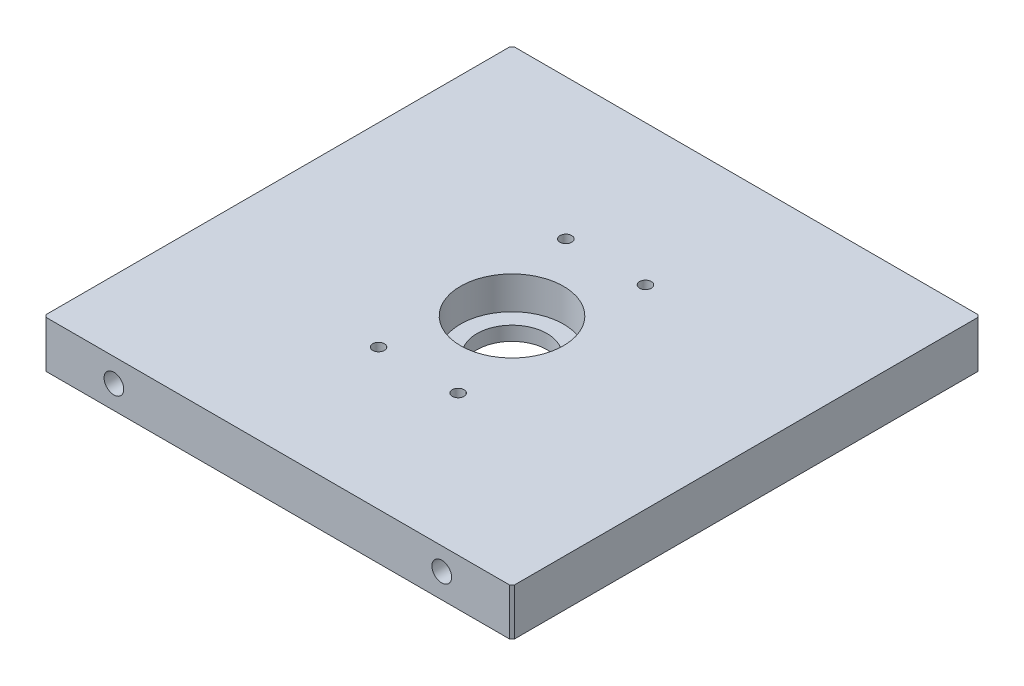
ISO-10303-21;
HEADER;
FILE_DESCRIPTION(('STEP AP214'),'2;1');
FILE_NAME('part.step','',(''),(''),'','','');
FILE_SCHEMA(('AUTOMOTIVE_DESIGN { 1 0 10303 214 1 1 1 1 }'));
ENDSEC;
DATA;
#1=APPLICATION_CONTEXT('core data for automotive mechanical design processes');
#2=APPLICATION_PROTOCOL_DEFINITION('international standard','automotive_design',2000,#1);
#3=PRODUCT_CONTEXT('',#1,'mechanical');
#4=PRODUCT('Part','Part','',(#3));
#5=PRODUCT_RELATED_PRODUCT_CATEGORY('part','',(#4));
#6=PRODUCT_DEFINITION_FORMATION('','',#4);
#7=PRODUCT_DEFINITION_CONTEXT('part definition',#1,'design');
#8=PRODUCT_DEFINITION('design','',#6,#7);
#9=PRODUCT_DEFINITION_SHAPE('','',#8);
#10=(LENGTH_UNIT() NAMED_UNIT(*) SI_UNIT(.MILLI.,.METRE.));
#11=(NAMED_UNIT(*) PLANE_ANGLE_UNIT() SI_UNIT($,.RADIAN.));
#12=(NAMED_UNIT(*) SI_UNIT($,.STERADIAN.) SOLID_ANGLE_UNIT());
#13=UNCERTAINTY_MEASURE_WITH_UNIT(LENGTH_MEASURE(1.E-05),#10,'distance_accuracy_value','');
#14=(GEOMETRIC_REPRESENTATION_CONTEXT(3) GLOBAL_UNCERTAINTY_ASSIGNED_CONTEXT((#13)) GLOBAL_UNIT_ASSIGNED_CONTEXT((#10,
#11,#12)) REPRESENTATION_CONTEXT('',''));
#15=CARTESIAN_POINT('',(0.,0.,0.));
#16=DIRECTION('',(0.,0.,1.));
#17=DIRECTION('',(1.,0.,0.));
#18=AXIS2_PLACEMENT_3D('',#15,#16,#17);
#19=CARTESIAN_POINT('',(0.,-5.,0.));
#20=DIRECTION('',(0.,1.,0.));
#21=DIRECTION('',(0.,0.,1.));
#22=AXIS2_PLACEMENT_3D('',#19,#20,#21);
#23=CYLINDRICAL_SURFACE('',#22,7.5);
#24=CARTESIAN_POINT('',(0.,-5.,0.));
#25=DIRECTION('',(0.,1.,0.));
#26=DIRECTION('',(0.,0.,1.));
#27=AXIS2_PLACEMENT_3D('',#24,#25,#26);
#28=CIRCLE('',#27,7.5);
#29=CARTESIAN_POINT('',(0.,-5.,7.5));
#30=VERTEX_POINT('',#29);
#31=EDGE_CURVE('E196',#30,#30,#28,.T.);
#32=ORIENTED_EDGE('',*,*,#31,.F.);
#33=EDGE_LOOP('',(#32));
#34=FACE_BOUND('',#33,.T.);
#35=CARTESIAN_POINT('',(0.,-2.,0.));
#36=DIRECTION('',(0.,1.,0.));
#37=DIRECTION('',(0.,0.,1.));
#38=AXIS2_PLACEMENT_3D('',#35,#36,#37);
#39=CIRCLE('',#38,7.5);
#40=CARTESIAN_POINT('',(0.,-2.,7.5));
#41=VERTEX_POINT('',#40);
#42=EDGE_CURVE('E181',#41,#41,#39,.F.);
#43=ORIENTED_EDGE('',*,*,#42,.F.);
#44=EDGE_LOOP('',(#43));
#45=FACE_BOUND('',#44,.T.);
#46=ADVANCED_FACE('F33',(#34,#45),#23,.F.);
#47=CARTESIAN_POINT('',(-50.,-5.,-50.));
#48=DIRECTION('',(-1.,0.,0.));
#49=DIRECTION('',(0.,0.,1.));
#50=AXIS2_PLACEMENT_3D('',#47,#48,#49);
#51=PLANE('',#50);
#52=DIRECTION('',(0.,0.,1.));
#53=VECTOR('',#52,1.);
#54=CARTESIAN_POINT('',(-50.,5.,-50.));
#55=LINE('',#54,#53);
#56=CARTESIAN_POINT('',(-50.,5.,-49.5));
#57=VERTEX_POINT('',#56);
#58=CARTESIAN_POINT('',(-50.,5.,49.5));
#59=VERTEX_POINT('',#58);
#60=EDGE_CURVE('E184',#57,#59,#55,.T.);
#61=ORIENTED_EDGE('',*,*,#60,.F.);
#62=DIRECTION('',(0.,-1.,0.));
#63=VECTOR('',#62,1.);
#64=CARTESIAN_POINT('',(-50.,-5.,-49.5));
#65=LINE('',#64,#63);
#66=CARTESIAN_POINT('',(-50.,-5.,-49.5));
#67=VERTEX_POINT('',#66);
#68=EDGE_CURVE('E240',#57,#67,#65,.T.);
#69=ORIENTED_EDGE('',*,*,#68,.T.);
#70=DIRECTION('',(0.,0.,1.));
#71=VECTOR('',#70,1.);
#72=CARTESIAN_POINT('',(-50.,-5.,-50.));
#73=LINE('',#72,#71);
#74=CARTESIAN_POINT('',(-50.,-5.,49.5));
#75=VERTEX_POINT('',#74);
#76=EDGE_CURVE('E199',#67,#75,#73,.T.);
#77=ORIENTED_EDGE('',*,*,#76,.T.);
#78=DIRECTION('',(0.,1.,0.));
#79=VECTOR('',#78,1.);
#80=CARTESIAN_POINT('',(-50.,-5.,49.5));
#81=LINE('',#80,#79);
#82=EDGE_CURVE('E237',#75,#59,#81,.T.);
#83=ORIENTED_EDGE('',*,*,#82,.T.);
#84=EDGE_LOOP('',(#61,#69,#77,#83));
#85=FACE_BOUND('',#84,.T.);
#86=ADVANCED_FACE('F254',(#85),#51,.T.);
#87=CARTESIAN_POINT('',(-50.,-5.,-50.));
#88=DIRECTION('',(0.,0.,-1.));
#89=DIRECTION('',(-1.,0.,0.));
#90=AXIS2_PLACEMENT_3D('',#87,#88,#89);
#91=PLANE('',#90);
#92=CARTESIAN_POINT('',(-35.,0.,-50.));
#93=DIRECTION('',(0.,0.,-1.));
#94=DIRECTION('',(-1.,0.,0.));
#95=AXIS2_PLACEMENT_3D('',#92,#93,#94);
#96=CIRCLE('',#95,2.1);
#97=CARTESIAN_POINT('',(-37.1,0.,-50.));
#98=VERTEX_POINT('',#97);
#99=EDGE_CURVE('E153',#98,#98,#96,.T.);
#100=ORIENTED_EDGE('',*,*,#99,.F.);
#101=EDGE_LOOP('',(#100));
#102=FACE_BOUND('',#101,.T.);
#103=CARTESIAN_POINT('',(35.,0.2375,-50.));
#104=DIRECTION('',(0.,0.,-1.));
#105=DIRECTION('',(-1.,0.,0.));
#106=AXIS2_PLACEMENT_3D('',#103,#104,#105);
#107=CIRCLE('',#106,2.1);
#108=CARTESIAN_POINT('',(32.9,0.2375,-50.));
#109=VERTEX_POINT('',#108);
#110=EDGE_CURVE('E159',#109,#109,#107,.T.);
#111=ORIENTED_EDGE('',*,*,#110,.F.);
#112=EDGE_LOOP('',(#111));
#113=FACE_BOUND('',#112,.T.);
#114=DIRECTION('',(-1.,0.,0.));
#115=VECTOR('',#114,1.);
#116=CARTESIAN_POINT('',(-50.,5.,-50.));
#117=LINE('',#116,#115);
#118=CARTESIAN_POINT('',(49.5,5.,-50.));
#119=VERTEX_POINT('',#118);
#120=CARTESIAN_POINT('',(-49.5,5.,-50.));
#121=VERTEX_POINT('',#120);
#122=EDGE_CURVE('E193',#119,#121,#117,.T.);
#123=ORIENTED_EDGE('',*,*,#122,.F.);
#124=DIRECTION('',(0.,-1.,0.));
#125=VECTOR('',#124,1.);
#126=CARTESIAN_POINT('',(49.5,-5.,-50.));
#127=LINE('',#126,#125);
#128=CARTESIAN_POINT('',(49.5,-5.,-50.));
#129=VERTEX_POINT('',#128);
#130=EDGE_CURVE('E228',#119,#129,#127,.T.);
#131=ORIENTED_EDGE('',*,*,#130,.T.);
#132=DIRECTION('',(-1.,0.,0.));
#133=VECTOR('',#132,1.);
#134=CARTESIAN_POINT('',(-50.,-5.,-50.));
#135=LINE('',#134,#133);
#136=CARTESIAN_POINT('',(-49.5,-5.,-50.));
#137=VERTEX_POINT('',#136);
#138=EDGE_CURVE('E207',#129,#137,#135,.T.);
#139=ORIENTED_EDGE('',*,*,#138,.T.);
#140=DIRECTION('',(0.,1.,0.));
#141=VECTOR('',#140,1.);
#142=CARTESIAN_POINT('',(-49.5,-5.,-50.));
#143=LINE('',#142,#141);
#144=EDGE_CURVE('E225',#137,#121,#143,.T.);
#145=ORIENTED_EDGE('',*,*,#144,.T.);
#146=EDGE_LOOP('',(#123,#131,#139,#145));
#147=FACE_BOUND('',#146,.T.);
#148=ADVANCED_FACE('F265',(#102,#113,#147),#91,.T.);
#149=CARTESIAN_POINT('',(50.,-5.,-50.));
#150=DIRECTION('',(1.,0.,0.));
#151=DIRECTION('',(0.,0.,-1.));
#152=AXIS2_PLACEMENT_3D('',#149,#150,#151);
#153=PLANE('',#152);
#154=DIRECTION('',(0.,0.,-1.));
#155=VECTOR('',#154,1.);
#156=CARTESIAN_POINT('',(50.,-5.,-50.));
#157=LINE('',#156,#155);
#158=CARTESIAN_POINT('',(50.,-5.,49.5));
#159=VERTEX_POINT('',#158);
#160=CARTESIAN_POINT('',(50.,-5.,-49.5));
#161=VERTEX_POINT('',#160);
#162=EDGE_CURVE('E204',#159,#161,#157,.T.);
#163=ORIENTED_EDGE('',*,*,#162,.T.);
#164=DIRECTION('',(0.,1.,0.));
#165=VECTOR('',#164,1.);
#166=CARTESIAN_POINT('',(50.,-5.,-49.5));
#167=LINE('',#166,#165);
#168=CARTESIAN_POINT('',(50.,5.,-49.5));
#169=VERTEX_POINT('',#168);
#170=EDGE_CURVE('E214',#161,#169,#167,.T.);
#171=ORIENTED_EDGE('',*,*,#170,.T.);
#172=DIRECTION('',(0.,0.,-1.));
#173=VECTOR('',#172,1.);
#174=CARTESIAN_POINT('',(50.,5.,-50.));
#175=LINE('',#174,#173);
#176=CARTESIAN_POINT('',(50.,5.,49.5));
#177=VERTEX_POINT('',#176);
#178=EDGE_CURVE('E190',#177,#169,#175,.T.);
#179=ORIENTED_EDGE('',*,*,#178,.F.);
#180=DIRECTION('',(0.,-1.,0.));
#181=VECTOR('',#180,1.);
#182=CARTESIAN_POINT('',(50.,-5.,49.5));
#183=LINE('',#182,#181);
#184=EDGE_CURVE('E210',#177,#159,#183,.T.);
#185=ORIENTED_EDGE('',*,*,#184,.T.);
#186=EDGE_LOOP('',(#163,#171,#179,#185));
#187=FACE_BOUND('',#186,.T.);
#188=ADVANCED_FACE('F272',(#187),#153,.T.);
#189=CARTESIAN_POINT('',(-50.,-5.,50.));
#190=DIRECTION('',(0.,0.,1.));
#191=DIRECTION('',(1.,0.,0.));
#192=AXIS2_PLACEMENT_3D('',#189,#190,#191);
#193=PLANE('',#192);
#194=CARTESIAN_POINT('',(-35.,0.,50.));
#195=DIRECTION('',(0.,0.,1.));
#196=DIRECTION('',(1.,0.,0.));
#197=AXIS2_PLACEMENT_3D('',#194,#195,#196);
#198=CIRCLE('',#197,2.1);
#199=CARTESIAN_POINT('',(-32.9,0.,50.));
#200=VERTEX_POINT('',#199);
#201=EDGE_CURVE('E165',#200,#200,#198,.T.);
#202=ORIENTED_EDGE('',*,*,#201,.F.);
#203=EDGE_LOOP('',(#202));
#204=FACE_BOUND('',#203,.T.);
#205=CARTESIAN_POINT('',(35.,0.2375,50.));
#206=DIRECTION('',(0.,0.,1.));
#207=DIRECTION('',(1.,0.,0.));
#208=AXIS2_PLACEMENT_3D('',#205,#206,#207);
#209=CIRCLE('',#208,2.1);
#210=CARTESIAN_POINT('',(37.1,0.2375,50.));
#211=VERTEX_POINT('',#210);
#212=EDGE_CURVE('E171',#211,#211,#209,.T.);
#213=ORIENTED_EDGE('',*,*,#212,.F.);
#214=EDGE_LOOP('',(#213));
#215=FACE_BOUND('',#214,.T.);
#216=DIRECTION('',(1.,0.,0.));
#217=VECTOR('',#216,1.);
#218=CARTESIAN_POINT('',(-50.,5.,50.));
#219=LINE('',#218,#217);
#220=CARTESIAN_POINT('',(-49.5,5.,50.));
#221=VERTEX_POINT('',#220);
#222=CARTESIAN_POINT('',(49.5,5.,50.));
#223=VERTEX_POINT('',#222);
#224=EDGE_CURVE('E187',#221,#223,#219,.T.);
#225=ORIENTED_EDGE('',*,*,#224,.F.);
#226=DIRECTION('',(0.,-1.,0.));
#227=VECTOR('',#226,1.);
#228=CARTESIAN_POINT('',(-49.5,-5.,50.));
#229=LINE('',#228,#227);
#230=CARTESIAN_POINT('',(-49.5,-5.,50.));
#231=VERTEX_POINT('',#230);
#232=EDGE_CURVE('E11',#221,#231,#229,.T.);
#233=ORIENTED_EDGE('',*,*,#232,.T.);
#234=DIRECTION('',(1.,0.,0.));
#235=VECTOR('',#234,1.);
#236=CARTESIAN_POINT('',(-50.,-5.,50.));
#237=LINE('',#236,#235);
#238=CARTESIAN_POINT('',(49.5,-5.,50.));
#239=VERTEX_POINT('',#238);
#240=EDGE_CURVE('E202',#231,#239,#237,.T.);
#241=ORIENTED_EDGE('',*,*,#240,.T.);
#242=DIRECTION('',(0.,1.,0.));
#243=VECTOR('',#242,1.);
#244=CARTESIAN_POINT('',(49.5,-5.,50.));
#245=LINE('',#244,#243);
#246=EDGE_CURVE('E41',#239,#223,#245,.T.);
#247=ORIENTED_EDGE('',*,*,#246,.T.);
#248=EDGE_LOOP('',(#225,#233,#241,#247));
#249=FACE_BOUND('',#248,.T.);
#250=ADVANCED_FACE('F243',(#204,#215,#249),#193,.T.);
#251=CARTESIAN_POINT('',(0.,-5.,0.));
#252=DIRECTION('',(0.,1.,0.));
#253=DIRECTION('',(0.,0.,1.));
#254=AXIS2_PLACEMENT_3D('',#251,#252,#253);
#255=PLANE('',#254);
#256=ORIENTED_EDGE('',*,*,#31,.T.);
#257=EDGE_LOOP('',(#256));
#258=FACE_BOUND('',#257,.T.);
#259=ORIENTED_EDGE('',*,*,#138,.F.);
#260=DIRECTION('',(-0.707106781186548,0.,-0.707106781186548));
#261=VECTOR('',#260,1.);
#262=CARTESIAN_POINT('',(50.,-5.,-49.5));
#263=LINE('',#262,#261);
#264=EDGE_CURVE('E235',#129,#161,#263,.F.);
#265=ORIENTED_EDGE('',*,*,#264,.T.);
#266=ORIENTED_EDGE('',*,*,#162,.F.);
#267=DIRECTION('',(0.707106781186557,0.,-0.707106781186538));
#268=VECTOR('',#267,1.);
#269=CARTESIAN_POINT('',(49.5,-5.,50.));
#270=LINE('',#269,#268);
#271=EDGE_CURVE('E48',#159,#239,#270,.F.);
#272=ORIENTED_EDGE('',*,*,#271,.T.);
#273=ORIENTED_EDGE('',*,*,#240,.F.);
#274=DIRECTION('',(0.707106781186548,0.,0.707106781186548));
#275=VECTOR('',#274,1.);
#276=CARTESIAN_POINT('',(-50.,-5.,49.5));
#277=LINE('',#276,#275);
#278=EDGE_CURVE('E231',#231,#75,#277,.F.);
#279=ORIENTED_EDGE('',*,*,#278,.T.);
#280=ORIENTED_EDGE('',*,*,#76,.F.);
#281=DIRECTION('',(-0.707106781186548,0.,0.707106781186548));
#282=VECTOR('',#281,1.);
#283=CARTESIAN_POINT('',(-49.5,-5.,-50.));
#284=LINE('',#283,#282);
#285=EDGE_CURVE('E233',#67,#137,#284,.F.);
#286=ORIENTED_EDGE('',*,*,#285,.T.);
#287=EDGE_LOOP('',(#259,#265,#266,#272,#273,#279,#280,#286));
#288=FACE_BOUND('',#287,.T.);
#289=ADVANCED_FACE('F259',(#258,#288),#255,.F.);
#290=CARTESIAN_POINT('',(0.,5.,0.));
#291=DIRECTION('',(0.,1.,0.));
#292=DIRECTION('',(0.,0.,1.));
#293=AXIS2_PLACEMENT_3D('',#290,#291,#292);
#294=PLANE('',#293);
#295=CARTESIAN_POINT('',(-8.49999999999999,5.,20.));
#296=DIRECTION('',(0.,1.,0.));
#297=DIRECTION('',(0.,0.,1.));
#298=AXIS2_PLACEMENT_3D('',#295,#296,#297);
#299=CIRCLE('',#298,1.24999999999999);
#300=CARTESIAN_POINT('',(-8.49999999999999,5.,21.25));
#301=VERTEX_POINT('',#300);
#302=EDGE_CURVE('E131',#301,#301,#299,.T.);
#303=ORIENTED_EDGE('',*,*,#302,.F.);
#304=EDGE_LOOP('',(#303));
#305=FACE_BOUND('',#304,.T.);
#306=CARTESIAN_POINT('',(8.50000000000001,5.,20.));
#307=DIRECTION('',(0.,1.,0.));
#308=DIRECTION('',(0.,0.,1.));
#309=AXIS2_PLACEMENT_3D('',#306,#307,#308);
#310=CIRCLE('',#309,1.24999999999999);
#311=CARTESIAN_POINT('',(8.50000000000001,5.,21.25));
#312=VERTEX_POINT('',#311);
#313=EDGE_CURVE('E130',#312,#312,#310,.T.);
#314=ORIENTED_EDGE('',*,*,#313,.F.);
#315=EDGE_LOOP('',(#314));
#316=FACE_BOUND('',#315,.T.);
#317=CARTESIAN_POINT('',(8.5,5.,-20.));
#318=DIRECTION('',(0.,1.,0.));
#319=DIRECTION('',(0.,0.,1.));
#320=AXIS2_PLACEMENT_3D('',#317,#318,#319);
#321=CIRCLE('',#320,1.24999999999999);
#322=CARTESIAN_POINT('',(8.5,5.,-18.75));
#323=VERTEX_POINT('',#322);
#324=EDGE_CURVE('E141',#323,#323,#321,.T.);
#325=ORIENTED_EDGE('',*,*,#324,.F.);
#326=EDGE_LOOP('',(#325));
#327=FACE_BOUND('',#326,.T.);
#328=CARTESIAN_POINT('',(-8.5,5.,-20.));
#329=DIRECTION('',(0.,1.,0.));
#330=DIRECTION('',(0.,0.,1.));
#331=AXIS2_PLACEMENT_3D('',#328,#329,#330);
#332=CIRCLE('',#331,1.24999999999999);
#333=CARTESIAN_POINT('',(-8.5,5.,-18.75));
#334=VERTEX_POINT('',#333);
#335=EDGE_CURVE('E147',#334,#334,#332,.T.);
#336=ORIENTED_EDGE('',*,*,#335,.F.);
#337=EDGE_LOOP('',(#336));
#338=FACE_BOUND('',#337,.T.);
#339=CARTESIAN_POINT('',(0.,5.,0.));
#340=DIRECTION('',(0.,1.,0.));
#341=DIRECTION('',(0.,0.,1.));
#342=AXIS2_PLACEMENT_3D('',#339,#340,#341);
#343=CIRCLE('',#342,11.);
#344=CARTESIAN_POINT('',(0.,5.,11.));
#345=VERTEX_POINT('',#344);
#346=EDGE_CURVE('E177',#345,#345,#343,.T.);
#347=ORIENTED_EDGE('',*,*,#346,.F.);
#348=EDGE_LOOP('',(#347));
#349=FACE_BOUND('',#348,.T.);
#350=ORIENTED_EDGE('',*,*,#178,.T.);
#351=DIRECTION('',(0.707106781186548,0.,0.707106781186548));
#352=VECTOR('',#351,1.);
#353=CARTESIAN_POINT('',(49.75,5.,-49.75));
#354=LINE('',#353,#352);
#355=EDGE_CURVE('E223',#169,#119,#354,.F.);
#356=ORIENTED_EDGE('',*,*,#355,.T.);
#357=ORIENTED_EDGE('',*,*,#122,.T.);
#358=DIRECTION('',(0.707106781186548,0.,-0.707106781186548));
#359=VECTOR('',#358,1.);
#360=CARTESIAN_POINT('',(-49.75,5.,-49.75));
#361=LINE('',#360,#359);
#362=EDGE_CURVE('E221',#121,#57,#361,.F.);
#363=ORIENTED_EDGE('',*,*,#362,.T.);
#364=ORIENTED_EDGE('',*,*,#60,.T.);
#365=DIRECTION('',(-0.707106781186548,0.,-0.707106781186548));
#366=VECTOR('',#365,1.);
#367=CARTESIAN_POINT('',(-49.75,5.,49.75));
#368=LINE('',#367,#366);
#369=EDGE_CURVE('E219',#59,#221,#368,.F.);
#370=ORIENTED_EDGE('',*,*,#369,.T.);
#371=ORIENTED_EDGE('',*,*,#224,.T.);
#372=DIRECTION('',(-0.707106781186557,0.,0.707106781186538));
#373=VECTOR('',#372,1.);
#374=CARTESIAN_POINT('',(49.7499999999993,5.,49.7500000000007));
#375=LINE('',#374,#373);
#376=EDGE_CURVE('E217',#223,#177,#375,.F.);
#377=ORIENTED_EDGE('',*,*,#376,.T.);
#378=EDGE_LOOP('',(#350,#356,#357,#363,#364,#370,#371,#377));
#379=FACE_BOUND('',#378,.T.);
#380=ADVANCED_FACE('F246',(#305,#316,#327,#338,#349,#379),#294,.T.);
#381=CARTESIAN_POINT('',(0.,-2.,0.));
#382=DIRECTION('',(0.,1.,0.));
#383=DIRECTION('',(0.,0.,1.));
#384=AXIS2_PLACEMENT_3D('',#381,#382,#383);
#385=PLANE('',#384);
#386=CARTESIAN_POINT('',(0.,-2.,0.));
#387=DIRECTION('',(0.,1.,0.));
#388=DIRECTION('',(0.,0.,1.));
#389=AXIS2_PLACEMENT_3D('',#386,#387,#388);
#390=CIRCLE('',#389,11.);
#391=CARTESIAN_POINT('',(0.,-2.,11.));
#392=VERTEX_POINT('',#391);
#393=EDGE_CURVE('E178',#392,#392,#390,.T.);
#394=ORIENTED_EDGE('',*,*,#393,.T.);
#395=EDGE_LOOP('',(#394));
#396=FACE_BOUND('',#395,.T.);
#397=ORIENTED_EDGE('',*,*,#42,.T.);
#398=EDGE_LOOP('',(#397));
#399=FACE_BOUND('',#398,.T.);
#400=ADVANCED_FACE('F472',(#396,#399),#385,.T.);
#401=CARTESIAN_POINT('',(0.,-2.,0.));
#402=DIRECTION('',(0.,1.,0.));
#403=DIRECTION('',(0.,0.,1.));
#404=AXIS2_PLACEMENT_3D('',#401,#402,#403);
#405=CYLINDRICAL_SURFACE('',#404,11.);
#406=ORIENTED_EDGE('',*,*,#393,.F.);
#407=EDGE_LOOP('',(#406));
#408=FACE_BOUND('',#407,.T.);
#409=ORIENTED_EDGE('',*,*,#346,.T.);
#410=EDGE_LOOP('',(#409));
#411=FACE_BOUND('',#410,.T.);
#412=ADVANCED_FACE('F463',(#408,#411),#405,.F.);
#413=CARTESIAN_POINT('',(35.,0.2375,40.));
#414=DIRECTION('',(0.,0.,1.));
#415=DIRECTION('',(1.,0.,0.));
#416=AXIS2_PLACEMENT_3D('',#413,#414,#415);
#417=CONICAL_SURFACE('',#416,2.1,1.02974425867665);
#418=CARTESIAN_POINT('',(35.,0.2375,38.7381927000421));
#419=VERTEX_POINT('',#418);
#420=VERTEX_LOOP('',#419);
#421=FACE_BOUND('',#420,.T.);
#422=CARTESIAN_POINT('',(35.,0.2375,40.));
#423=DIRECTION('',(0.,0.,1.));
#424=DIRECTION('',(1.,0.,0.));
#425=AXIS2_PLACEMENT_3D('',#422,#423,#424);
#426=CIRCLE('',#425,2.1);
#427=CARTESIAN_POINT('',(37.1,0.2375,40.));
#428=VERTEX_POINT('',#427);
#429=EDGE_CURVE('E174',#428,#428,#426,.T.);
#430=ORIENTED_EDGE('',*,*,#429,.T.);
#431=EDGE_LOOP('',(#430));
#432=FACE_BOUND('',#431,.T.);
#433=ADVANCED_FACE('F454',(#421,#432),#417,.F.);
#434=CARTESIAN_POINT('',(35.,0.2375,50.));
#435=DIRECTION('',(0.,0.,1.));
#436=DIRECTION('',(1.,0.,0.));
#437=AXIS2_PLACEMENT_3D('',#434,#435,#436);
#438=CYLINDRICAL_SURFACE('',#437,2.1);
#439=ORIENTED_EDGE('',*,*,#429,.F.);
#440=EDGE_LOOP('',(#439));
#441=FACE_BOUND('',#440,.T.);
#442=ORIENTED_EDGE('',*,*,#212,.T.);
#443=EDGE_LOOP('',(#442));
#444=FACE_BOUND('',#443,.T.);
#445=ADVANCED_FACE('F445',(#441,#444),#438,.F.);
#446=CARTESIAN_POINT('',(-35.,0.,40.));
#447=DIRECTION('',(0.,0.,1.));
#448=DIRECTION('',(1.,0.,0.));
#449=AXIS2_PLACEMENT_3D('',#446,#447,#448);
#450=CONICAL_SURFACE('',#449,2.1,1.02974425867665);
#451=CARTESIAN_POINT('',(-35.,0.,38.7381927000421));
#452=VERTEX_POINT('',#451);
#453=VERTEX_LOOP('',#452);
#454=FACE_BOUND('',#453,.T.);
#455=CARTESIAN_POINT('',(-35.,0.,40.));
#456=DIRECTION('',(0.,0.,1.));
#457=DIRECTION('',(1.,0.,0.));
#458=AXIS2_PLACEMENT_3D('',#455,#456,#457);
#459=CIRCLE('',#458,2.1);
#460=CARTESIAN_POINT('',(-32.9,0.,40.));
#461=VERTEX_POINT('',#460);
#462=EDGE_CURVE('E168',#461,#461,#459,.T.);
#463=ORIENTED_EDGE('',*,*,#462,.T.);
#464=EDGE_LOOP('',(#463));
#465=FACE_BOUND('',#464,.T.);
#466=ADVANCED_FACE('F436',(#454,#465),#450,.F.);
#467=CARTESIAN_POINT('',(-35.,0.,50.));
#468=DIRECTION('',(0.,0.,1.));
#469=DIRECTION('',(1.,0.,0.));
#470=AXIS2_PLACEMENT_3D('',#467,#468,#469);
#471=CYLINDRICAL_SURFACE('',#470,2.1);
#472=ORIENTED_EDGE('',*,*,#462,.F.);
#473=EDGE_LOOP('',(#472));
#474=FACE_BOUND('',#473,.T.);
#475=ORIENTED_EDGE('',*,*,#201,.T.);
#476=EDGE_LOOP('',(#475));
#477=FACE_BOUND('',#476,.T.);
#478=ADVANCED_FACE('F427',(#474,#477),#471,.F.);
#479=CARTESIAN_POINT('',(35.,0.2375,-40.));
#480=DIRECTION('',(0.,0.,-1.));
#481=DIRECTION('',(-1.,0.,0.));
#482=AXIS2_PLACEMENT_3D('',#479,#480,#481);
#483=CONICAL_SURFACE('',#482,2.1,1.02974425867665);
#484=CARTESIAN_POINT('',(35.,0.2375,-38.7381927000421));
#485=VERTEX_POINT('',#484);
#486=VERTEX_LOOP('',#485);
#487=FACE_BOUND('',#486,.T.);
#488=CARTESIAN_POINT('',(35.,0.2375,-40.));
#489=DIRECTION('',(0.,0.,-1.));
#490=DIRECTION('',(-1.,0.,0.));
#491=AXIS2_PLACEMENT_3D('',#488,#489,#490);
#492=CIRCLE('',#491,2.1);
#493=CARTESIAN_POINT('',(32.9,0.2375,-40.));
#494=VERTEX_POINT('',#493);
#495=EDGE_CURVE('E162',#494,#494,#492,.T.);
#496=ORIENTED_EDGE('',*,*,#495,.T.);
#497=EDGE_LOOP('',(#496));
#498=FACE_BOUND('',#497,.T.);
#499=ADVANCED_FACE('F418',(#487,#498),#483,.F.);
#500=CARTESIAN_POINT('',(35.,0.2375,-50.));
#501=DIRECTION('',(0.,0.,-1.));
#502=DIRECTION('',(-1.,0.,0.));
#503=AXIS2_PLACEMENT_3D('',#500,#501,#502);
#504=CYLINDRICAL_SURFACE('',#503,2.1);
#505=ORIENTED_EDGE('',*,*,#495,.F.);
#506=EDGE_LOOP('',(#505));
#507=FACE_BOUND('',#506,.T.);
#508=ORIENTED_EDGE('',*,*,#110,.T.);
#509=EDGE_LOOP('',(#508));
#510=FACE_BOUND('',#509,.T.);
#511=ADVANCED_FACE('F409',(#507,#510),#504,.F.);
#512=CARTESIAN_POINT('',(-35.,0.,-40.));
#513=DIRECTION('',(0.,0.,-1.));
#514=DIRECTION('',(-1.,0.,0.));
#515=AXIS2_PLACEMENT_3D('',#512,#513,#514);
#516=CONICAL_SURFACE('',#515,2.1,1.02974425867665);
#517=CARTESIAN_POINT('',(-35.,0.,-38.7381927000421));
#518=VERTEX_POINT('',#517);
#519=VERTEX_LOOP('',#518);
#520=FACE_BOUND('',#519,.T.);
#521=CARTESIAN_POINT('',(-35.,0.,-40.));
#522=DIRECTION('',(0.,0.,-1.));
#523=DIRECTION('',(-1.,0.,0.));
#524=AXIS2_PLACEMENT_3D('',#521,#522,#523);
#525=CIRCLE('',#524,2.1);
#526=CARTESIAN_POINT('',(-37.1,0.,-40.));
#527=VERTEX_POINT('',#526);
#528=EDGE_CURVE('E156',#527,#527,#525,.T.);
#529=ORIENTED_EDGE('',*,*,#528,.T.);
#530=EDGE_LOOP('',(#529));
#531=FACE_BOUND('',#530,.T.);
#532=ADVANCED_FACE('F400',(#520,#531),#516,.F.);
#533=CARTESIAN_POINT('',(-35.,0.,-50.));
#534=DIRECTION('',(0.,0.,-1.));
#535=DIRECTION('',(-1.,0.,0.));
#536=AXIS2_PLACEMENT_3D('',#533,#534,#535);
#537=CYLINDRICAL_SURFACE('',#536,2.1);
#538=ORIENTED_EDGE('',*,*,#528,.F.);
#539=EDGE_LOOP('',(#538));
#540=FACE_BOUND('',#539,.T.);
#541=ORIENTED_EDGE('',*,*,#99,.T.);
#542=EDGE_LOOP('',(#541));
#543=FACE_BOUND('',#542,.T.);
#544=ADVANCED_FACE('F391',(#540,#543),#537,.F.);
#545=CARTESIAN_POINT('',(-8.5,-1.,-20.));
#546=DIRECTION('',(0.,1.,0.));
#547=DIRECTION('',(0.,0.,1.));
#548=AXIS2_PLACEMENT_3D('',#545,#546,#547);
#549=CONICAL_SURFACE('',#548,1.25,1.02974425867665);
#550=CARTESIAN_POINT('',(-8.5,-1.75107577378445,-20.));
#551=VERTEX_POINT('',#550);
#552=VERTEX_LOOP('',#551);
#553=FACE_BOUND('',#552,.T.);
#554=CARTESIAN_POINT('',(-8.5,-1.,-20.));
#555=DIRECTION('',(0.,1.,0.));
#556=DIRECTION('',(0.,0.,1.));
#557=AXIS2_PLACEMENT_3D('',#554,#555,#556);
#558=CIRCLE('',#557,1.25);
#559=CARTESIAN_POINT('',(-8.5,-1.,-18.75));
#560=VERTEX_POINT('',#559);
#561=EDGE_CURVE('E150',#560,#560,#558,.T.);
#562=ORIENTED_EDGE('',*,*,#561,.T.);
#563=EDGE_LOOP('',(#562));
#564=FACE_BOUND('',#563,.T.);
#565=ADVANCED_FACE('F382',(#553,#564),#549,.F.);
#566=CARTESIAN_POINT('',(-8.5,5.,-20.));
#567=DIRECTION('',(0.,1.,0.));
#568=DIRECTION('',(0.,0.,1.));
#569=AXIS2_PLACEMENT_3D('',#566,#567,#568);
#570=CYLINDRICAL_SURFACE('',#569,1.24999999999999);
#571=ORIENTED_EDGE('',*,*,#561,.F.);
#572=EDGE_LOOP('',(#571));
#573=FACE_BOUND('',#572,.T.);
#574=ORIENTED_EDGE('',*,*,#335,.T.);
#575=EDGE_LOOP('',(#574));
#576=FACE_BOUND('',#575,.T.);
#577=ADVANCED_FACE('F373',(#573,#576),#570,.F.);
#578=CARTESIAN_POINT('',(8.5,-1.,-20.));
#579=DIRECTION('',(0.,1.,0.));
#580=DIRECTION('',(0.,0.,1.));
#581=AXIS2_PLACEMENT_3D('',#578,#579,#580);
#582=CONICAL_SURFACE('',#581,1.25,1.02974425867665);
#583=CARTESIAN_POINT('',(8.5,-1.75107577378445,-20.));
#584=VERTEX_POINT('',#583);
#585=VERTEX_LOOP('',#584);
#586=FACE_BOUND('',#585,.T.);
#587=CARTESIAN_POINT('',(8.5,-1.,-20.));
#588=DIRECTION('',(0.,1.,0.));
#589=DIRECTION('',(0.,0.,1.));
#590=AXIS2_PLACEMENT_3D('',#587,#588,#589);
#591=CIRCLE('',#590,1.25);
#592=CARTESIAN_POINT('',(8.5,-1.,-18.75));
#593=VERTEX_POINT('',#592);
#594=EDGE_CURVE('E144',#593,#593,#591,.T.);
#595=ORIENTED_EDGE('',*,*,#594,.T.);
#596=EDGE_LOOP('',(#595));
#597=FACE_BOUND('',#596,.T.);
#598=ADVANCED_FACE('F364',(#586,#597),#582,.F.);
#599=CARTESIAN_POINT('',(8.5,5.,-20.));
#600=DIRECTION('',(0.,1.,0.));
#601=DIRECTION('',(0.,0.,1.));
#602=AXIS2_PLACEMENT_3D('',#599,#600,#601);
#603=CYLINDRICAL_SURFACE('',#602,1.24999999999999);
#604=ORIENTED_EDGE('',*,*,#594,.F.);
#605=EDGE_LOOP('',(#604));
#606=FACE_BOUND('',#605,.T.);
#607=ORIENTED_EDGE('',*,*,#324,.T.);
#608=EDGE_LOOP('',(#607));
#609=FACE_BOUND('',#608,.T.);
#610=ADVANCED_FACE('F355',(#606,#609),#603,.F.);
#611=CARTESIAN_POINT('',(8.50000000000001,-1.,20.));
#612=DIRECTION('',(0.,1.,0.));
#613=DIRECTION('',(0.,0.,1.));
#614=AXIS2_PLACEMENT_3D('',#611,#612,#613);
#615=CONICAL_SURFACE('',#614,1.25,1.02974425867665);
#616=CARTESIAN_POINT('',(8.5,-1.75107577378445,20.));
#617=VERTEX_POINT('',#616);
#618=VERTEX_LOOP('',#617);
#619=FACE_BOUND('',#618,.T.);
#620=CARTESIAN_POINT('',(8.50000000000001,-1.,20.));
#621=DIRECTION('',(0.,1.,0.));
#622=DIRECTION('',(0.,0.,1.));
#623=AXIS2_PLACEMENT_3D('',#620,#621,#622);
#624=CIRCLE('',#623,1.25);
#625=CARTESIAN_POINT('',(8.50000000000001,-1.,21.25));
#626=VERTEX_POINT('',#625);
#627=EDGE_CURVE('E134',#626,#626,#624,.T.);
#628=ORIENTED_EDGE('',*,*,#627,.T.);
#629=EDGE_LOOP('',(#628));
#630=FACE_BOUND('',#629,.T.);
#631=ADVANCED_FACE('F346',(#619,#630),#615,.F.);
#632=CARTESIAN_POINT('',(8.50000000000001,5.,20.));
#633=DIRECTION('',(0.,1.,0.));
#634=DIRECTION('',(0.,0.,1.));
#635=AXIS2_PLACEMENT_3D('',#632,#633,#634);
#636=CYLINDRICAL_SURFACE('',#635,1.24999999999999);
#637=ORIENTED_EDGE('',*,*,#627,.F.);
#638=EDGE_LOOP('',(#637));
#639=FACE_BOUND('',#638,.T.);
#640=ORIENTED_EDGE('',*,*,#313,.T.);
#641=EDGE_LOOP('',(#640));
#642=FACE_BOUND('',#641,.T.);
#643=ADVANCED_FACE('F124',(#639,#642),#636,.F.);
#644=CARTESIAN_POINT('',(-8.49999999999999,-1.,20.));
#645=DIRECTION('',(0.,1.,0.));
#646=DIRECTION('',(0.,0.,1.));
#647=AXIS2_PLACEMENT_3D('',#644,#645,#646);
#648=CONICAL_SURFACE('',#647,1.25,1.02974425867665);
#649=CARTESIAN_POINT('',(-8.5,-1.75107577378445,20.));
#650=VERTEX_POINT('',#649);
#651=VERTEX_LOOP('',#650);
#652=FACE_BOUND('',#651,.T.);
#653=CARTESIAN_POINT('',(-8.49999999999999,-1.,20.));
#654=DIRECTION('',(0.,1.,0.));
#655=DIRECTION('',(0.,0.,1.));
#656=AXIS2_PLACEMENT_3D('',#653,#654,#655);
#657=CIRCLE('',#656,1.25);
#658=CARTESIAN_POINT('',(-8.49999999999999,-1.,21.25));
#659=VERTEX_POINT('',#658);
#660=EDGE_CURVE('E128',#659,#659,#657,.T.);
#661=ORIENTED_EDGE('',*,*,#660,.T.);
#662=EDGE_LOOP('',(#661));
#663=FACE_BOUND('',#662,.T.);
#664=ADVANCED_FACE('F120',(#652,#663),#648,.F.);
#665=CARTESIAN_POINT('',(-8.49999999999999,5.,20.));
#666=DIRECTION('',(0.,1.,0.));
#667=DIRECTION('',(0.,0.,1.));
#668=AXIS2_PLACEMENT_3D('',#665,#666,#667);
#669=CYLINDRICAL_SURFACE('',#668,1.24999999999999);
#670=ORIENTED_EDGE('',*,*,#660,.F.);
#671=EDGE_LOOP('',(#670));
#672=FACE_BOUND('',#671,.T.);
#673=ORIENTED_EDGE('',*,*,#302,.T.);
#674=EDGE_LOOP('',(#673));
#675=FACE_BOUND('',#674,.T.);
#676=ADVANCED_FACE('F123',(#672,#675),#669,.F.);
#677=CARTESIAN_POINT('',(50.,-5.,-49.5));
#678=DIRECTION('',(-0.707106781186548,0.,0.707106781186548));
#679=DIRECTION('',(0.,1.,0.));
#680=AXIS2_PLACEMENT_3D('',#677,#678,#679);
#681=PLANE('',#680);
#682=ORIENTED_EDGE('',*,*,#264,.F.);
#683=ORIENTED_EDGE('',*,*,#130,.F.);
#684=ORIENTED_EDGE('',*,*,#355,.F.);
#685=ORIENTED_EDGE('',*,*,#170,.F.);
#686=EDGE_LOOP('',(#682,#683,#684,#685));
#687=FACE_BOUND('',#686,.T.);
#688=ADVANCED_FACE('F270',(#687),#681,.F.);
#689=CARTESIAN_POINT('',(-49.5,-5.,-50.));
#690=DIRECTION('',(0.707106781186547,0.,0.707106781186547));
#691=DIRECTION('',(0.,1.,0.));
#692=AXIS2_PLACEMENT_3D('',#689,#690,#691);
#693=PLANE('',#692);
#694=ORIENTED_EDGE('',*,*,#285,.F.);
#695=ORIENTED_EDGE('',*,*,#68,.F.);
#696=ORIENTED_EDGE('',*,*,#362,.F.);
#697=ORIENTED_EDGE('',*,*,#144,.F.);
#698=EDGE_LOOP('',(#694,#695,#696,#697));
#699=FACE_BOUND('',#698,.T.);
#700=ADVANCED_FACE('F262',(#699),#693,.F.);
#701=CARTESIAN_POINT('',(-50.,-5.,49.5));
#702=DIRECTION('',(0.707106781186547,0.,-0.707106781186547));
#703=DIRECTION('',(0.,1.,0.));
#704=AXIS2_PLACEMENT_3D('',#701,#702,#703);
#705=PLANE('',#704);
#706=ORIENTED_EDGE('',*,*,#278,.F.);
#707=ORIENTED_EDGE('',*,*,#232,.F.);
#708=ORIENTED_EDGE('',*,*,#369,.F.);
#709=ORIENTED_EDGE('',*,*,#82,.F.);
#710=EDGE_LOOP('',(#706,#707,#708,#709));
#711=FACE_BOUND('',#710,.T.);
#712=ADVANCED_FACE('F252',(#711),#705,.F.);
#713=CARTESIAN_POINT('',(49.5,-5.,50.));
#714=DIRECTION('',(-0.707106781186538,0.,-0.707106781186557));
#715=DIRECTION('',(0.,1.,0.));
#716=AXIS2_PLACEMENT_3D('',#713,#714,#715);
#717=PLANE('',#716);
#718=ORIENTED_EDGE('',*,*,#271,.F.);
#719=ORIENTED_EDGE('',*,*,#184,.F.);
#720=ORIENTED_EDGE('',*,*,#376,.F.);
#721=ORIENTED_EDGE('',*,*,#246,.F.);
#722=EDGE_LOOP('',(#718,#719,#720,#721));
#723=FACE_BOUND('',#722,.T.);
#724=ADVANCED_FACE('F35',(#723),#717,.F.);
#725=CLOSED_SHELL('',(#46,#86,#148,#188,#250,#289,#380,#400,#412,#433,#445,#466,#478,#499,#511,
#532,#544,#565,#577,#598,#610,#631,#643,#664,#676,#688,#700,#712,#724));
#726=MANIFOLD_SOLID_BREP('B2',#725);
#727=ADVANCED_BREP_SHAPE_REPRESENTATION('',(#18,#726),#14);
#728=SHAPE_DEFINITION_REPRESENTATION(#9,#727);
ENDSEC;
END-ISO-10303-21;
